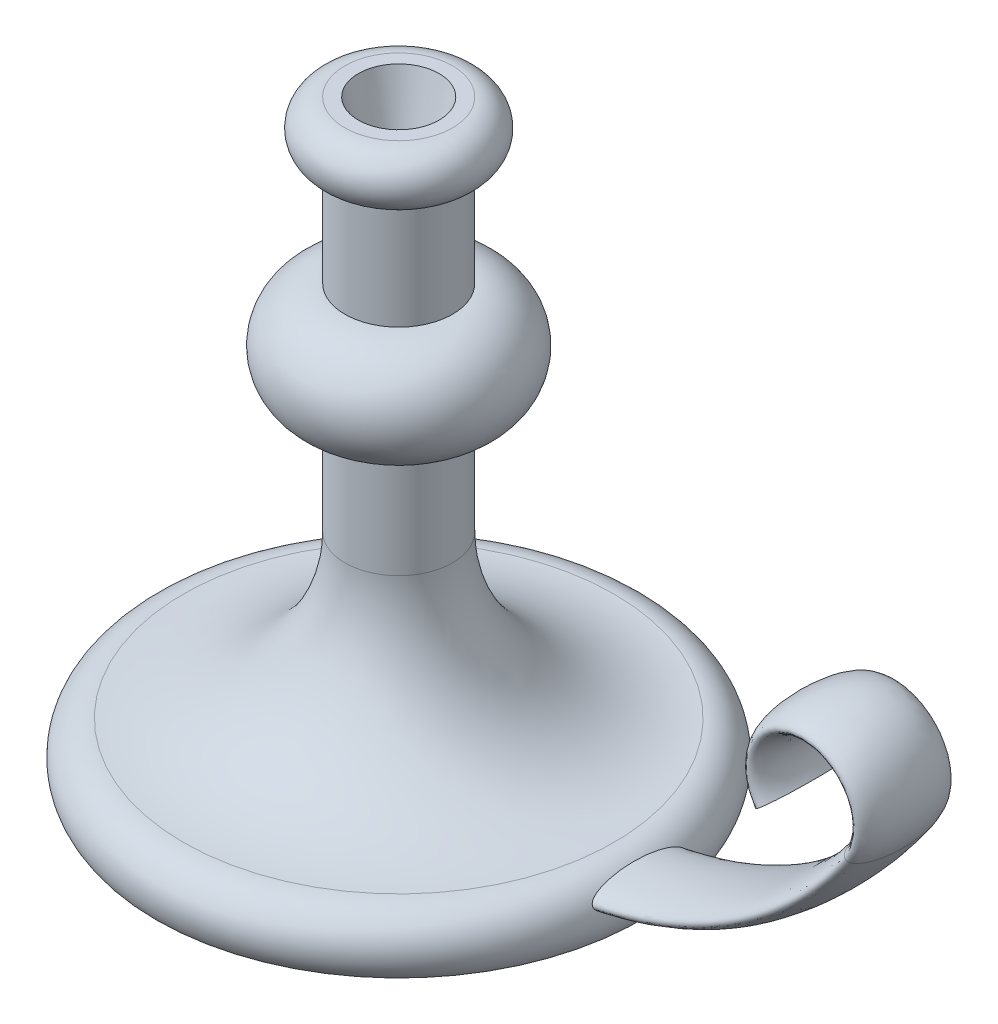
ISO-10303-21;
HEADER;
FILE_DESCRIPTION(('STEP AP214'),'2;1');
FILE_NAME('part.step','',(''),(''),'','','');
FILE_SCHEMA(('AUTOMOTIVE_DESIGN { 1 0 10303 214 1 1 1 1 }'));
ENDSEC;
DATA;
#1=APPLICATION_CONTEXT('core data for automotive mechanical design processes');
#2=APPLICATION_PROTOCOL_DEFINITION('international standard','automotive_design',2000,#1);
#3=PRODUCT_CONTEXT('',#1,'mechanical');
#4=PRODUCT('Part','Part','',(#3));
#5=PRODUCT_RELATED_PRODUCT_CATEGORY('part','',(#4));
#6=PRODUCT_DEFINITION_FORMATION('','',#4);
#7=PRODUCT_DEFINITION_CONTEXT('part definition',#1,'design');
#8=PRODUCT_DEFINITION('design','',#6,#7);
#9=PRODUCT_DEFINITION_SHAPE('','',#8);
#10=(LENGTH_UNIT() NAMED_UNIT(*) SI_UNIT(.MILLI.,.METRE.));
#11=(NAMED_UNIT(*) PLANE_ANGLE_UNIT() SI_UNIT($,.RADIAN.));
#12=(NAMED_UNIT(*) SI_UNIT($,.STERADIAN.) SOLID_ANGLE_UNIT());
#13=UNCERTAINTY_MEASURE_WITH_UNIT(LENGTH_MEASURE(1.E-05),#10,'distance_accuracy_value','');
#14=(GEOMETRIC_REPRESENTATION_CONTEXT(3) GLOBAL_UNCERTAINTY_ASSIGNED_CONTEXT((#13)) GLOBAL_UNIT_ASSIGNED_CONTEXT((#10,
#11,#12)) REPRESENTATION_CONTEXT('',''));
#15=CARTESIAN_POINT('',(0.,0.,0.));
#16=DIRECTION('',(0.,0.,1.));
#17=DIRECTION('',(1.,0.,0.));
#18=AXIS2_PLACEMENT_3D('',#15,#16,#17);
#19=CARTESIAN_POINT('',(0.,0.,0.));
#20=DIRECTION('',(0.,-1.,0.));
#21=DIRECTION('',(0.,0.,-1.));
#22=AXIS2_PLACEMENT_3D('',#19,#20,#21);
#23=PLANE('',#22);
#24=CARTESIAN_POINT('',(0.,0.,0.));
#25=DIRECTION('',(0.,-1.,0.));
#26=DIRECTION('',(0.,0.,-1.));
#27=AXIS2_PLACEMENT_3D('',#24,#25,#26);
#28=CIRCLE('',#27,90.);
#29=CARTESIAN_POINT('',(0.,0.,-90.));
#30=VERTEX_POINT('',#29);
#31=EDGE_CURVE('E81',#30,#30,#28,.T.);
#32=ORIENTED_EDGE('',*,*,#31,.T.);
#33=EDGE_LOOP('',(#32));
#34=FACE_BOUND('',#33,.T.);
#35=ADVANCED_FACE('F41',(#34),#23,.T.);
#36=CARTESIAN_POINT('',(0.,220.,0.));
#37=DIRECTION('',(0.,1.,0.));
#38=DIRECTION('',(0.,0.,1.));
#39=AXIS2_PLACEMENT_3D('',#36,#37,#38);
#40=PLANE('',#39);
#41=CARTESIAN_POINT('',(0.,220.,0.));
#42=DIRECTION('',(0.,1.,0.));
#43=DIRECTION('',(0.,0.,1.));
#44=AXIS2_PLACEMENT_3D('',#41,#42,#43);
#45=CIRCLE('',#44,15.);
#46=CARTESIAN_POINT('',(0.,220.,15.));
#47=VERTEX_POINT('',#46);
#48=EDGE_CURVE('E97',#47,#47,#45,.T.);
#49=ORIENTED_EDGE('',*,*,#48,.F.);
#50=EDGE_LOOP('',(#49));
#51=FACE_BOUND('',#50,.T.);
#52=CARTESIAN_POINT('',(0.,220.,0.));
#53=DIRECTION('',(0.,-1.,0.));
#54=DIRECTION('',(0.,0.,-1.));
#55=AXIS2_PLACEMENT_3D('',#52,#53,#54);
#56=CIRCLE('',#55,20.);
#57=CARTESIAN_POINT('',(0.,220.,-20.));
#58=VERTEX_POINT('',#57);
#59=EDGE_CURVE('E53',#58,#58,#56,.T.);
#60=ORIENTED_EDGE('',*,*,#59,.F.);
#61=EDGE_LOOP('',(#60));
#62=FACE_BOUND('',#61,.T.);
#63=ADVANCED_FACE('F104',(#51,#62),#40,.T.);
#64=CARTESIAN_POINT('',(0.,210.,0.));
#65=DIRECTION('',(0.,-1.,0.));
#66=DIRECTION('',(0.,0.,-1.));
#67=AXIS2_PLACEMENT_3D('',#64,#65,#66);
#68=TOROIDAL_SURFACE('',#67,20.,10.);
#69=ORIENTED_EDGE('',*,*,#59,.T.);
#70=EDGE_LOOP('',(#69));
#71=FACE_BOUND('',#70,.T.);
#72=CARTESIAN_POINT('',(0.,200.,0.));
#73=DIRECTION('',(0.,-1.,0.));
#74=DIRECTION('',(0.,0.,-1.));
#75=AXIS2_PLACEMENT_3D('',#72,#73,#74);
#76=CIRCLE('',#75,20.);
#77=CARTESIAN_POINT('',(0.,200.,-20.));
#78=VERTEX_POINT('',#77);
#79=EDGE_CURVE('E58',#78,#78,#76,.T.);
#80=ORIENTED_EDGE('',*,*,#79,.F.);
#81=EDGE_LOOP('',(#80));
#82=FACE_BOUND('',#81,.T.);
#83=ADVANCED_FACE('F107',(#71,#82),#68,.T.);
#84=CARTESIAN_POINT('',(0.,0.,0.));
#85=DIRECTION('',(0.,-1.,0.));
#86=DIRECTION('',(0.,0.,-1.));
#87=AXIS2_PLACEMENT_3D('',#84,#85,#86);
#88=CYLINDRICAL_SURFACE('',#87,20.);
#89=ORIENTED_EDGE('',*,*,#79,.T.);
#90=EDGE_LOOP('',(#89));
#91=FACE_BOUND('',#90,.T.);
#92=CARTESIAN_POINT('',(0.,160.,0.));
#93=DIRECTION('',(0.,-1.,0.));
#94=DIRECTION('',(0.,0.,-1.));
#95=AXIS2_PLACEMENT_3D('',#92,#93,#94);
#96=CIRCLE('',#95,20.);
#97=CARTESIAN_POINT('',(0.,160.,-20.));
#98=VERTEX_POINT('',#97);
#99=EDGE_CURVE('E63',#98,#98,#96,.T.);
#100=ORIENTED_EDGE('',*,*,#99,.F.);
#101=EDGE_LOOP('',(#100));
#102=FACE_BOUND('',#101,.T.);
#103=ADVANCED_FACE('F112',(#91,#102),#88,.T.);
#104=CARTESIAN_POINT('',(0.,140.,0.));
#105=DIRECTION('',(0.,-1.,0.));
#106=DIRECTION('',(0.,0.,-1.));
#107=AXIS2_PLACEMENT_3D('',#104,#105,#106);
#108=DEGENERATE_TOROIDAL_SURFACE('',#107,20.,20.,.T.);
#109=ORIENTED_EDGE('',*,*,#99,.T.);
#110=EDGE_LOOP('',(#109));
#111=FACE_BOUND('',#110,.T.);
#112=CARTESIAN_POINT('',(0.,120.,0.));
#113=DIRECTION('',(0.,-1.,0.));
#114=DIRECTION('',(0.,0.,-1.));
#115=AXIS2_PLACEMENT_3D('',#112,#113,#114);
#116=CIRCLE('',#115,20.);
#117=CARTESIAN_POINT('',(0.,120.,-20.));
#118=VERTEX_POINT('',#117);
#119=EDGE_CURVE('E69',#118,#118,#116,.T.);
#120=ORIENTED_EDGE('',*,*,#119,.F.);
#121=EDGE_LOOP('',(#120));
#122=FACE_BOUND('',#121,.T.);
#123=ADVANCED_FACE('F118',(#111,#122),#108,.T.);
#124=CARTESIAN_POINT('',(0.,0.,0.));
#125=DIRECTION('',(0.,-1.,0.));
#126=DIRECTION('',(0.,0.,-1.));
#127=AXIS2_PLACEMENT_3D('',#124,#125,#126);
#128=CYLINDRICAL_SURFACE('',#127,20.);
#129=ORIENTED_EDGE('',*,*,#119,.T.);
#130=EDGE_LOOP('',(#129));
#131=FACE_BOUND('',#130,.T.);
#132=CARTESIAN_POINT('',(0.,80.,0.));
#133=DIRECTION('',(0.,-1.,0.));
#134=DIRECTION('',(0.,0.,-1.));
#135=AXIS2_PLACEMENT_3D('',#132,#133,#134);
#136=CIRCLE('',#135,20.);
#137=CARTESIAN_POINT('',(0.,80.,-20.));
#138=VERTEX_POINT('',#137);
#139=EDGE_CURVE('E73',#138,#138,#136,.T.);
#140=ORIENTED_EDGE('',*,*,#139,.F.);
#141=EDGE_LOOP('',(#140));
#142=FACE_BOUND('',#141,.T.);
#143=ADVANCED_FACE('F122',(#131,#142),#128,.T.);
#144=CARTESIAN_POINT('',(0.,79.9999999999999,0.));
#145=DIRECTION('',(0.,-1.,0.));
#146=DIRECTION('',(0.,0.,-1.));
#147=AXIS2_PLACEMENT_3D('',#144,#145,#146);
#148=TOROIDAL_SURFACE('',#147,80.,60.);
#149=ORIENTED_EDGE('',*,*,#139,.T.);
#150=EDGE_LOOP('',(#149));
#151=FACE_BOUND('',#150,.T.);
#152=CARTESIAN_POINT('',(0.,19.9999999999999,0.));
#153=DIRECTION('',(0.,-1.,0.));
#154=DIRECTION('',(0.,0.,-1.));
#155=AXIS2_PLACEMENT_3D('',#152,#153,#154);
#156=CIRCLE('',#155,79.9999999999999);
#157=CARTESIAN_POINT('',(0.,19.9999999999999,-79.9999999999999));
#158=VERTEX_POINT('',#157);
#159=EDGE_CURVE('E77',#158,#158,#156,.T.);
#160=ORIENTED_EDGE('',*,*,#159,.F.);
#161=EDGE_LOOP('',(#160));
#162=FACE_BOUND('',#161,.T.);
#163=ADVANCED_FACE('F126',(#151,#162),#148,.F.);
#164=CARTESIAN_POINT('',(0.,7.49999999999991,0.));
#165=DIRECTION('',(0.,-1.,0.));
#166=DIRECTION('',(0.,0.,-1.));
#167=AXIS2_PLACEMENT_3D('',#164,#165,#166);
#168=TOROIDAL_SURFACE('',#167,79.9999999999999,12.5);
#169=CARTESIAN_POINT('',(89.559742204334,12.9414346567556,-17.5));
#170=CARTESIAN_POINT('',(89.539061840356,12.9834100865229,-17.4999996776707));
#171=CARTESIAN_POINT('',(89.5184817634658,13.0254349004938,-17.4978446678338));
#172=CARTESIAN_POINT('',(89.4776811982742,13.1092324497794,-17.4892861575811));
#173=CARTESIAN_POINT('',(89.4574608430709,13.1510050881611,-17.4828811168849));
#174=CARTESIAN_POINT('',(89.3975402811208,13.2754779151414,-17.4575154450276));
#175=CARTESIAN_POINT('',(89.3585808220612,13.357332519418,-17.4324042670614));
#176=CARTESIAN_POINT('',(89.2734407804367,13.537917999339,-17.3597430943198));
#177=CARTESIAN_POINT('',(89.2281116968573,13.6353152430682,-17.3079906529225));
#178=CARTESIAN_POINT('',(89.1421567137608,13.8217570109409,-17.1881654215547));
#179=CARTESIAN_POINT('',(89.1015409681599,13.9107834263932,-17.1200583326704));
#180=CARTESIAN_POINT('',(89.0298799325303,14.0690063055582,-16.9825317839868));
#181=CARTESIAN_POINT('',(88.998285603108,14.1392491335227,-16.9145677994464));
#182=CARTESIAN_POINT('',(88.9378435588021,14.2742914925202,-16.7722502997375));
#183=CARTESIAN_POINT('',(88.908998073478,14.3390866000317,-16.6978916893925));
#184=CARTESIAN_POINT('',(88.8536099995592,14.4639626152392,-16.544217780153));
#185=CARTESIAN_POINT('',(88.8270733532935,14.5240313225779,-16.4648905452803));
#186=CARTESIAN_POINT('',(88.7760376587062,14.6398576639347,-16.302586394246));
#187=CARTESIAN_POINT('',(88.7515379613227,14.6956166708124,-16.219610653644));
#188=CARTESIAN_POINT('',(88.7047328205489,14.8023169553037,-16.052427362784));
#189=CARTESIAN_POINT('',(88.6823939519364,14.8533308765833,-15.9682752160745));
#190=CARTESIAN_POINT('',(88.6391553657588,14.9521540950118,-15.7977416210759));
#191=CARTESIAN_POINT('',(88.618255889972,14.9999628537459,-15.711359801597));
#192=CARTESIAN_POINT('',(88.5573681790007,15.1392585624724,-15.4492483073625));
#193=CARTESIAN_POINT('',(88.5192579811326,15.2264609786255,-15.2707999543232));
#194=CARTESIAN_POINT('',(88.4468979005835,15.3916731276291,-14.9088289385943));
#195=CARTESIAN_POINT('',(88.4126513155025,15.4696750103546,-14.725302105289));
#196=CARTESIAN_POINT('',(88.3471391595038,15.6182965032923,-14.3538259785735));
#197=CARTESIAN_POINT('',(88.3158872528144,15.6888824046966,-14.1658608782526));
#198=CARTESIAN_POINT('',(88.2560127035515,15.8233792512431,-13.7874003918539));
#199=CARTESIAN_POINT('',(88.2273872233001,15.8872974109118,-13.5969079973402));
#200=CARTESIAN_POINT('',(88.1723348827447,16.0094159388249,-13.2138496737789));
#201=CARTESIAN_POINT('',(88.1459074726894,16.0676177374301,-13.0212842768929));
#202=CARTESIAN_POINT('',(88.08842483047,16.1932687928886,-12.5849658119246));
#203=CARTESIAN_POINT('',(88.0579162002182,16.2592725226906,-12.3407253521733));
#204=CARTESIAN_POINT('',(87.9994625659012,16.3844358500306,-11.850180346078));
#205=CARTESIAN_POINT('',(87.9715178234087,16.4435947494062,-11.6038755919221));
#206=CARTESIAN_POINT('',(87.9178897421856,16.5558889779776,-11.1095299870478));
#207=CARTESIAN_POINT('',(87.8922075114267,16.6090213595568,-10.8614883492399));
#208=CARTESIAN_POINT('',(87.8429155378601,16.7098546386226,-10.3640943607016));
#209=CARTESIAN_POINT('',(87.819305894281,16.7575552760879,-10.1147419478209));
#210=CARTESIAN_POINT('',(87.7514718906045,16.8930622945828,-9.36631396644889));
#211=CARTESIAN_POINT('',(87.7101114199138,16.97354616682,-8.86564202060303));
#212=CARTESIAN_POINT('',(87.6344118706352,17.1178657179368,-7.86153551840217));
#213=CARTESIAN_POINT('',(87.6000713341077,17.1817048544489,-7.35810155802552));
#214=CARTESIAN_POINT('',(87.5383679228552,17.2943697092708,-6.35225136111862));
#215=CARTESIAN_POINT('',(87.5109639050817,17.3432843238913,-5.84984753787545));
#216=CARTESIAN_POINT('',(87.462839163061,17.4279603163538,-4.84354228831));
#217=CARTESIAN_POINT('',(87.4421195253371,17.4637195559667,-4.3396406319408));
#218=CARTESIAN_POINT('',(87.4074386787953,17.5229738360405,-3.33084363886005));
#219=CARTESIAN_POINT('',(87.393478087488,17.5464677559495,-2.82594821558673));
#220=CARTESIAN_POINT('',(87.3724154174233,17.5817273168609,-1.81615213380796));
#221=CARTESIAN_POINT('',(87.3653059747337,17.5935055508652,-1.31125206554514));
#222=CARTESIAN_POINT('',(87.3579750479623,17.6056484066489,-0.301318309132852));
#223=CARTESIAN_POINT('',(87.3577528582348,17.6060141977103,0.203715360026144));
#224=CARTESIAN_POINT('',(87.3641963426437,17.5953454261039,1.21356726554174));
#225=CARTESIAN_POINT('',(87.3708612610894,17.5843121142068,1.71838551945512));
#226=CARTESIAN_POINT('',(87.3886163883336,17.554616306541,2.60695068649856));
#227=CARTESIAN_POINT('',(87.3982690399211,17.5384060734754,2.99081046478843));
#228=CARTESIAN_POINT('',(87.4214966880658,17.4990063104014,3.75807002785716));
#229=CARTESIAN_POINT('',(87.4350718235979,17.4758165331044,4.14146979585432));
#230=CARTESIAN_POINT('',(87.466110901612,17.4221255760208,4.90767543763214));
#231=CARTESIAN_POINT('',(87.4835755913647,17.3916229911934,5.29048118303764));
#232=CARTESIAN_POINT('',(87.5224765269598,17.3226675403927,6.05728766608042));
#233=CARTESIAN_POINT('',(87.5439339089182,17.2841722314846,6.44128353835447));
#234=CARTESIAN_POINT('',(87.5907685418076,17.1987228636429,7.20803081067563));
#235=CARTESIAN_POINT('',(87.6161451191904,17.1517702579396,7.59078241304237));
#236=CARTESIAN_POINT('',(87.6708875244927,17.0486132676472,8.35453102594122));
#237=CARTESIAN_POINT('',(87.7002509792862,16.9924143825779,8.73552894189143));
#238=CARTESIAN_POINT('',(87.755569338574,16.8844873931684,9.40362807317354));
#239=CARTESIAN_POINT('',(87.7806318626289,16.8349635590468,9.6911595586557));
#240=CARTESIAN_POINT('',(87.8333287645206,16.7293167465828,10.2648242071224));
#241=CARTESIAN_POINT('',(87.860963530467,16.6731927720484,10.5509571522123));
#242=CARTESIAN_POINT('',(87.9190678138247,16.5534902310351,11.1217112831613));
#243=CARTESIAN_POINT('',(87.9495404231882,16.4899035134826,11.4063304543326));
#244=CARTESIAN_POINT('',(88.0137266324374,16.3541216812726,11.9738772339477));
#245=CARTESIAN_POINT('',(88.0474477220506,16.2819065762201,12.2567992545899));
#246=CARTESIAN_POINT('',(88.1183718381952,16.1280994435203,12.8175821097589));
#247=CARTESIAN_POINT('',(88.1555499028382,16.046573796357,13.0954641920683));
#248=CARTESIAN_POINT('',(88.2343580118384,15.8719007074313,13.6468218234688));
#249=CARTESIAN_POINT('',(88.2759857295857,15.7787593350284,13.9202995902183));
#250=CARTESIAN_POINT('',(88.3426568223938,15.6283840406489,14.3254052817093));
#251=CARTESIAN_POINT('',(88.3655500017784,15.5765627213431,14.4594023169282));
#252=CARTESIAN_POINT('',(88.4129882653632,15.4688611687534,14.7254525655376));
#253=CARTESIAN_POINT('',(88.4375331689949,15.4129813790935,14.8575059894888));
#254=CARTESIAN_POINT('',(88.4884967907571,15.296726972035,15.1188747284345));
#255=CARTESIAN_POINT('',(88.5149109123157,15.2363633637365,15.2481958098581));
#256=CARTESIAN_POINT('',(88.570024175177,15.1103179001211,15.5037035642083));
#257=CARTESIAN_POINT('',(88.5987227483176,15.0446373670988,15.6298910063174));
#258=CARTESIAN_POINT('',(88.6570151826477,14.9113179601608,15.870419970706));
#259=CARTESIAN_POINT('',(88.6864417367859,14.8440563407289,15.9850095995261));
#260=CARTESIAN_POINT('',(88.7482816567767,14.7030103830826,16.2094581395953));
#261=CARTESIAN_POINT('',(88.780697475614,14.629220689998,16.3193130551169));
#262=CARTESIAN_POINT('',(88.8489097184971,14.4745639616531,16.5315146626624));
#263=CARTESIAN_POINT('',(88.8846785573507,14.3937550191611,16.6339121024917));
#264=CARTESIAN_POINT('',(88.9606113704151,14.2232561160766,16.8291907541923));
#265=CARTESIAN_POINT('',(89.0007675950251,14.1335818404864,16.9220882016583));
#266=CARTESIAN_POINT('',(89.0601235459871,14.0021924630804,17.0411637727685));
#267=CARTESIAN_POINT('',(89.0770574086404,13.9648250339927,17.073294917827));
#268=CARTESIAN_POINT('',(89.1117704043088,13.8885105828123,17.1351129203988));
#269=CARTESIAN_POINT('',(89.1295494801997,13.8495636674961,17.1647999427302));
#270=CARTESIAN_POINT('',(89.1842722230346,13.7301865324198,17.2496672583031));
#271=CARTESIAN_POINT('',(89.2225929343974,13.6472387371286,17.3006362954167));
#272=CARTESIAN_POINT('',(89.2830198855203,13.5177923286576,17.3659392171785));
#273=CARTESIAN_POINT('',(89.3038035106324,13.4734899832391,17.385944655127));
#274=CARTESIAN_POINT('',(89.346235727213,13.3835498526412,17.421521231844));
#275=CARTESIAN_POINT('',(89.3678838017235,13.3379128698458,17.4370949768748));
#276=CARTESIAN_POINT('',(89.4119048024239,13.2456714845448,17.4633118273199));
#277=CARTESIAN_POINT('',(89.4342765183815,13.1990687398023,17.4739627514632));
#278=CARTESIAN_POINT('',(89.4796070415906,13.1052444737537,17.4900003628641));
#279=CARTESIAN_POINT('',(89.5025657624808,13.0580230439623,17.495387819971));
#280=CARTESIAN_POINT('',(89.5464271716018,12.9684112208445,17.5004320668286));
#281=CARTESIAN_POINT('',(89.5672934245651,12.9260327119426,17.5006298436875));
#282=CARTESIAN_POINT('',(89.6091580078855,12.8415284156483,17.496667300483));
#283=CARTESIAN_POINT('',(89.6301563797467,12.7994027167221,17.4925055351934));
#284=CARTESIAN_POINT('',(89.6721156351429,12.7157496198108,17.479965082583));
#285=CARTESIAN_POINT('',(89.6930765014328,12.6742224548788,17.4715847960013));
#286=CARTESIAN_POINT('',(89.7348115258833,12.5920532516238,17.450862522026));
#287=CARTESIAN_POINT('',(89.755585576578,12.5514117057388,17.4385183877269));
#288=CARTESIAN_POINT('',(89.8013847331776,12.4623676182577,17.4070626989759));
#289=CARTESIAN_POINT('',(89.8263321178973,12.4142402057078,17.3870577635768));
#290=CARTESIAN_POINT('',(89.8756026524762,12.3198942829529,17.3423007335127));
#291=CARTESIAN_POINT('',(89.8999253272691,12.2736772101063,17.317545140678));
#292=CARTESIAN_POINT('',(89.9718636752114,12.1379719567038,17.2371059859824));
#293=CARTESIAN_POINT('',(90.0184026508767,12.0515209207989,17.1752845379973));
#294=CARTESIAN_POINT('',(90.1015176697337,11.8991704299986,17.0502729237444));
#295=CARTESIAN_POINT('',(90.1385373685484,11.8321383297489,16.9886971231213));
#296=CARTESIAN_POINT('',(90.2104869329279,11.7032426034951,16.8591573255862));
#297=CARTESIAN_POINT('',(90.2454151408798,11.6413830620089,16.7911883686366));
#298=CARTESIAN_POINT('',(90.3133841124365,11.5222099067342,16.6502911436157));
#299=CARTESIAN_POINT('',(90.3464212107124,11.4649050425,16.577353807455));
#300=CARTESIAN_POINT('',(90.4107258034174,11.3544143267812,16.4277349965839));
#301=CARTESIAN_POINT('',(90.4419937497578,11.3012274221162,16.3510544874357));
#302=CARTESIAN_POINT('',(90.5066142435686,11.1922810586095,16.1853189525368));
#303=CARTESIAN_POINT('',(90.5397652495638,11.1369814833085,16.095884783533));
#304=CARTESIAN_POINT('',(90.6043042941241,11.0303194621557,15.9140859303204));
#305=CARTESIAN_POINT('',(90.6356921559875,10.9789574107339,15.8217209538334));
#306=CARTESIAN_POINT('',(90.696838387797,10.879769884165,15.6347974994411));
#307=CARTESIAN_POINT('',(90.7265992701636,10.8319389137697,15.5402427441418));
#308=CARTESIAN_POINT('',(90.7846969346251,10.739329513768,15.3492353522603));
#309=CARTESIAN_POINT('',(90.8130337948204,10.6945509167066,15.2527828201661));
#310=CARTESIAN_POINT('',(90.8771212205239,10.5940589597548,15.027731983768));
#311=CARTESIAN_POINT('',(90.9124022819657,10.5393328792864,14.8985593440138));
#312=CARTESIAN_POINT('',(90.9809741103801,10.4339610325183,14.6380328432606));
#313=CARTESIAN_POINT('',(91.0142645951402,10.3833158444316,14.5066786763344));
#314=CARTESIAN_POINT('',(91.1115171918213,10.2366440116076,14.1096810918776));
#315=CARTESIAN_POINT('',(91.1727828792966,10.1460018602113,13.8413800425914));
#316=CARTESIAN_POINT('',(91.289286281246,9.976154557269,13.2997906638454));
#317=CARTESIAN_POINT('',(91.3445203789087,9.89695625887023,13.026499455453));
#318=CARTESIAN_POINT('',(91.449980571998,9.74769654866252,12.4748594155942));
#319=CARTESIAN_POINT('',(91.5001780442572,9.67768673078006,12.1964912536691));
#320=CARTESIAN_POINT('',(91.5957501918068,9.54592534416375,11.6372393425737));
#321=CARTESIAN_POINT('',(91.6411285723794,9.48416742117616,11.3563577087898));
#322=CARTESIAN_POINT('',(91.7275132616964,9.36779787162535,10.7925089006667));
#323=CARTESIAN_POINT('',(91.7685202729421,9.31318509647911,10.5095420692673));
#324=CARTESIAN_POINT('',(91.8503345045437,9.20520508711794,9.91387150213504));
#325=CARTESIAN_POINT('',(91.8907217744488,9.152493900958,9.60099168323481));
#326=CARTESIAN_POINT('',(91.9669218199109,9.05389158705521,8.97359688181812));
#327=CARTESIAN_POINT('',(92.002734366163,9.00800080116127,8.65908181815785));
#328=CARTESIAN_POINT('',(92.07003298894,8.92240020575297,8.02865568808615));
#329=CARTESIAN_POINT('',(92.1015177516249,8.88269227276186,7.71274422766328));
#330=CARTESIAN_POINT('',(92.1603325838503,8.80898713679297,7.07986626810441));
#331=CARTESIAN_POINT('',(92.1876625005419,8.77499014390492,6.76289973059227));
#332=CARTESIAN_POINT('',(92.263503001365,8.68114273902091,5.81249868362058));
#333=CARTESIAN_POINT('',(92.3060517448553,8.62919999492185,5.17778747193678));
#334=CARTESIAN_POINT('',(92.3760091017524,8.54431318450685,3.9062793818665));
#335=CARTESIAN_POINT('',(92.4034169750228,8.51137004695184,3.26948240305109));
#336=CARTESIAN_POINT('',(92.4435085691827,8.46331702284117,1.99545741778258));
#337=CARTESIAN_POINT('',(92.4562084043364,8.44818761908846,1.35823064985229));
#338=CARTESIAN_POINT('',(92.4671302630245,8.43517103988554,0.0834423270795608));
#339=CARTESIAN_POINT('',(92.4653514271758,8.43728488791035,-0.55411924538934));
#340=CARTESIAN_POINT('',(92.4472853754492,8.45883344750927,-1.82886328297122));
#341=CARTESIAN_POINT('',(92.4309954438923,8.47827140120335,-2.46604565478238));
#342=CARTESIAN_POINT('',(92.3836590626408,8.53514174464802,-3.73902583867153));
#343=CARTESIAN_POINT('',(92.352614080813,8.5725723444523,-4.37482378215656));
#344=CARTESIAN_POINT('',(92.2921790866401,8.64621329195009,-5.3662554446113));
#345=CARTESIAN_POINT('',(92.2680118235606,8.67578736963495,-5.72271555902012));
#346=CARTESIAN_POINT('',(92.2147013952353,8.74146404735406,-6.43465819603434));
#347=CARTESIAN_POINT('',(92.1855583836331,8.77756644580552,-6.79014074848109));
#348=CARTESIAN_POINT('',(92.1221127048891,8.85679311513365,-7.49983836059601));
#349=CARTESIAN_POINT('',(92.0878103957547,8.89991689880838,-7.85405350646578));
#350=CARTESIAN_POINT('',(92.0137981226248,8.99384143269665,-8.56089767224022));
#351=CARTESIAN_POINT('',(91.9740883343955,9.04464193338996,-8.9135267433144));
#352=CARTESIAN_POINT('',(91.9015818240061,9.13842562293733,-9.51226790233205));
#353=CARTESIAN_POINT('',(91.8702370654069,9.17924629619452,-9.7588957593429));
#354=CARTESIAN_POINT('',(91.8045624920056,9.26550036635929,-10.2509419620311));
#355=CARTESIAN_POINT('',(91.7702327567068,9.31093364041786,-10.4963603397384));
#356=CARTESIAN_POINT('',(91.6984266463269,9.40685898724898,-10.9855805665744));
#357=CARTESIAN_POINT('',(91.6609523533814,9.45734771681983,-11.2293833718174));
#358=CARTESIAN_POINT('',(91.582603896789,9.56401317099042,-11.7151775621055));
#359=CARTESIAN_POINT('',(91.5417298772534,9.62018965451331,-11.9571690234582));
#360=CARTESIAN_POINT('',(91.4386423376744,9.763512109964,-12.538416201849));
#361=CARTESIAN_POINT('',(91.3745858903286,9.85386844470763,-12.8765786557777));
#362=CARTESIAN_POINT('',(91.2720163238265,10.0014015523808,-13.3793136041317));
#363=CARTESIAN_POINT('',(91.236709096999,10.0526332971695,-13.5462966135012));
#364=CARTESIAN_POINT('',(91.1637294936455,10.159626184162,-13.878285337956));
#365=CARTESIAN_POINT('',(91.1260572231719,10.2153871233021,-14.0432911413079));
#366=CARTESIAN_POINT('',(91.0448513753995,10.336938272787,-14.3844416693133));
#367=CARTESIAN_POINT('',(91.0010908407913,10.40317678906,-14.5603739146119));
#368=CARTESIAN_POINT('',(90.9100440331644,10.54285093242,-14.9085311659835));
#369=CARTESIAN_POINT('',(90.8627565865344,10.6162889577865,-15.0807549132318));
#370=CARTESIAN_POINT('',(90.7642492199852,10.7715651970484,-15.4195496037307));
#371=CARTESIAN_POINT('',(90.7130423069864,10.853375906557,-15.5861368065588));
#372=CARTESIAN_POINT('',(90.6058220172111,11.0275348916432,-15.9120386126952));
#373=CARTESIAN_POINT('',(90.5498128203451,11.1198740259083,-16.0713593593327));
#374=CARTESIAN_POINT('',(90.4444082893049,11.2969255920344,-16.3465910082043));
#375=CARTESIAN_POINT('',(90.3961277047702,11.3791055101427,-16.4645448336192));
#376=CARTESIAN_POINT('',(90.2950977924845,11.5538633486869,-16.6911566146554));
#377=CARTESIAN_POINT('',(90.2423390562529,11.6464633011956,-16.7997939840169));
#378=CARTESIAN_POINT('',(90.1590440243454,11.7953014200275,-16.9524870890688));
#379=CARTESIAN_POINT('',(90.1303607600845,11.84698592154,-17.0019977189783));
#380=CARTESIAN_POINT('',(90.0716181087373,11.9538274561512,-17.0963102611101));
#381=CARTESIAN_POINT('',(90.0415584049392,12.0089852895526,-17.1411110817341));
#382=CARTESIAN_POINT('',(89.9801756575594,12.1227246632092,-17.2246441347399));
#383=CARTESIAN_POINT('',(89.9488577537649,12.1812926416251,-17.2633984155374));
#384=CARTESIAN_POINT('',(89.8849549671326,12.3020144005064,-17.3335784406432));
#385=CARTESIAN_POINT('',(89.8523712452271,12.3641649194657,-17.3650107233705));
#386=CARTESIAN_POINT('',(89.7981176909032,12.4687258013538,-17.4092508881816));
#387=CARTESIAN_POINT('',(89.7767436177654,12.5101841078547,-17.4246893204628));
#388=CARTESIAN_POINT('',(89.7336969050673,12.5942336377179,-17.4515182330193));
#389=CARTESIAN_POINT('',(89.712024381391,12.6368244270181,-17.4629102408533));
#390=CARTESIAN_POINT('',(89.6685521390581,12.7228207531293,-17.4812886417918));
#391=CARTESIAN_POINT('',(89.6467526103344,12.7662252198271,-17.488280453409));
#392=CARTESIAN_POINT('',(89.6031794397245,12.8535466229689,-17.4976362320133));
#393=CARTESIAN_POINT('',(89.5814057970821,12.8974635440192,-17.5000003376542));
#394=CARTESIAN_POINT('',(89.559742204334,12.9414346567556,-17.5));
#395=B_SPLINE_CURVE_WITH_KNOTS('',3,(#169,#170,#171,#172,#173,#174,#175,#176,#177,#178,#179,
#180,#181,#182,#183,#184,#185,#186,#187,#188,#189,#190,#191,#192,#193,#194,#195,#196,#197,#198,
#199,#200,#201,#202,#203,#204,#205,#206,#207,#208,#209,#210,#211,#212,#213,#214,#215,#216,#217,
#218,#219,#220,#221,#222,#223,#224,#225,#226,#227,#228,#229,#230,#231,#232,#233,#234,#235,#236,
#237,#238,#239,#240,#241,#242,#243,#244,#245,#246,#247,#248,#249,#250,#251,#252,#253,#254,#255,
#256,#257,#258,#259,#260,#261,#262,#263,#264,#265,#266,#267,#268,#269,#270,#271,#272,#273,#274,
#275,#276,#277,#278,#279,#280,#281,#282,#283,#284,#285,#286,#287,#288,#289,#290,#291,#292,#293,
#294,#295,#296,#297,#298,#299,#300,#301,#302,#303,#304,#305,#306,#307,#308,#309,#310,#311,#312,
#313,#314,#315,#316,#317,#318,#319,#320,#321,#322,#323,#324,#325,#326,#327,#328,#329,#330,#331,
#332,#333,#334,#335,#336,#337,#338,#339,#340,#341,#342,#343,#344,#345,#346,#347,#348,#349,#350,
#351,#352,#353,#354,#355,#356,#357,#358,#359,#360,#361,#362,#363,#364,#365,#366,#367,#368,#369,
#370,#371,#372,#373,#374,#375,#376,#377,#378,#379,#380,#381,#382,#383,#384,#385,#386,#387,#388,
#389,#390,#391,#392,#393,#394),.UNSPECIFIED.,.T.,.F.,(4,2,2,2,2,2,2,2,2,2,2,2,2,2,2,2,2,2,2,2,2,
2,2,2,2,2,2,2,2,2,2,2,2,2,2,2,2,2,2,2,2,2,2,2,2,2,2,2,2,2,2,2,2,2,2,2,2,2,2,2,2,2,2,2,2,2,2,2,2,
2,2,2,2,2,2,2,2,2,2,2,2,2,2,2,2,2,2,2,2,2,2,2,2,2,2,2,2,2,2,2,2,2,2,2,2,2,2,2,2,2,2,2,4),(0.,
0.140326879649318,0.280704643844314,0.561461806499952,0.917225717585815,1.27374235386086,
1.58146302398149,1.88943119593643,2.19816989275477,2.50680983170028,2.80944292372752,
3.11212672643259,3.71838915770196,4.32516518168251,4.93458970782549,5.54334784093543,
6.15195325906655,6.91631911029052,7.68076285707095,8.44557890144734,9.21043154271139,
10.7363530227228,12.2619572680852,13.7782885580524,15.2948661984784,16.8115823682403,
18.3266664767785,19.8415953542036,21.3563580231469,22.5092504482308,23.6621837256809,
24.8153386988898,25.9747813799631,27.1340250219355,28.2925816429425,29.1710242088839,
30.0495995331115,30.9291435591543,31.8107663507035,32.6864555684208,33.5616891298977,
33.9980703124478,34.4344038665404,34.8696994156048,35.3048870393031,35.7129485465614,
36.1213479397354,36.5266413619585,36.931230132163,37.0874810726011,37.2437214677038,
37.556282943945,37.7147148343192,37.8730533580127,38.0311395270883,38.1892025705742,
38.3307149014329,38.4722741597124,38.6138871242242,38.7555769191152,38.9286541005774,
39.1018592207182,39.448590135234,39.7429975955387,40.0376353818192,40.3328261359409,
40.6279411430424,40.9585479808937,41.2891878931732,41.6193018978019,41.9493977775693,
42.3832551508603,42.8171738887974,43.6859467918773,44.5552378220708,45.429218266337,
46.3025217875288,47.1756847521821,48.1351081860343,49.0945796914533,50.0543418354873,
51.0141392787946,52.9283366636025,54.8426276125099,56.7548192562828,58.667124399218,
60.5797874956882,62.4922603557716,63.5676819321866,64.643070307189,65.7183840946042,
66.7936629380637,67.5494303160615,68.3051775707202,69.0604283053787,69.8156470419362,
70.882676588736,71.4172057561806,71.9517109715335,72.5305894861733,73.1096614946439,
73.6868888443998,74.2636187787017,74.718095055338,75.1735510009093,75.4046853668805,
75.6358731855899,75.8661972266868,76.096314797092,76.2435550398537,76.3907396389804,
76.537742634799,76.6847412260987),.UNSPECIFIED.);
#396=CARTESIAN_POINT('',(89.559742204334,12.9414346567556,-17.5));
#397=VERTEX_POINT('',#396);
#398=EDGE_CURVE('E10',#397,#397,#395,.T.);
#399=ORIENTED_EDGE('',*,*,#398,.F.);
#400=EDGE_LOOP('',(#399));
#401=FACE_BOUND('',#400,.T.);
#402=ORIENTED_EDGE('',*,*,#159,.T.);
#403=EDGE_LOOP('',(#402));
#404=FACE_BOUND('',#403,.T.);
#405=ORIENTED_EDGE('',*,*,#31,.F.);
#406=EDGE_LOOP('',(#405));
#407=FACE_BOUND('',#406,.T.);
#408=ADVANCED_FACE('F129',(#401,#404,#407),#168,.T.);
#409=CARTESIAN_POINT('',(150.634185358261,75.,0.));
#410=DIRECTION('',(0.566666666666667,-0.823947139620552,0.));
#411=DIRECTION('',(0.,0.,-1.));
#412=AXIS2_PLACEMENT_3D('',#409,#410,#411);
#413=PLANE('',#412);
#414=CARTESIAN_POINT('',(150.634185358261,75.,0.));
#415=DIRECTION('',(0.566666666666667,-0.823947139620552,0.));
#416=DIRECTION('',(0.,0.,-1.));
#417=AXIS2_PLACEMENT_3D('',#414,#415,#416);
#418=ELLIPSE('',#417,17.5,5.);
#419=CARTESIAN_POINT('',(150.634185358261,75.,-17.5));
#420=VERTEX_POINT('',#419);
#421=EDGE_CURVE('E85',#420,#420,#418,.T.);
#422=ORIENTED_EDGE('',*,*,#421,.T.);
#423=EDGE_LOOP('',(#422));
#424=FACE_BOUND('',#423,.T.);
#425=ADVANCED_FACE('F134',(#424),#413,.T.);
#426=CARTESIAN_POINT('',(60.,10.,-17.5));
#427=CARTESIAN_POINT('',(110.410191303973,10.,-17.5));
#428=CARTESIAN_POINT('',(155.026295870831,33.4646670673665,-17.5));
#429=CARTESIAN_POINT('',(183.592070943083,75.,-17.5));
#430=CARTESIAN_POINT('',(60.,20.0000000000001,-17.5));
#431=CARTESIAN_POINT('',(107.049511883708,20.,-17.5));
#432=CARTESIAN_POINT('',(148.691209479442,41.9003559295421,-17.5));
#433=CARTESIAN_POINT('',(175.352599546877,80.6666666666667,-17.5));
#434=CARTESIAN_POINT('',(60.,20.0000000000001,17.5));
#435=CARTESIAN_POINT('',(107.049511883708,20.,17.5));
#436=CARTESIAN_POINT('',(148.691209479442,41.9003559295421,17.5));
#437=CARTESIAN_POINT('',(175.352599546877,80.6666666666667,17.5));
#438=CARTESIAN_POINT('',(60.,10.,17.5));
#439=CARTESIAN_POINT('',(110.410191303973,10.,17.5));
#440=CARTESIAN_POINT('',(155.026295870831,33.4646670673665,17.5));
#441=CARTESIAN_POINT('',(183.592070943083,75.,17.5));
#442=CARTESIAN_POINT('',(60.,0.,17.5));
#443=CARTESIAN_POINT('',(113.770870724238,0.,17.5));
#444=CARTESIAN_POINT('',(161.36138226222,25.0289782051909,17.5));
#445=CARTESIAN_POINT('',(191.831542339288,69.3333333333333,17.5));
#446=CARTESIAN_POINT('',(60.,0.,-17.5));
#447=CARTESIAN_POINT('',(113.770870724238,0.,-17.5));
#448=CARTESIAN_POINT('',(161.36138226222,25.0289782051909,-17.5));
#449=CARTESIAN_POINT('',(191.831542339288,69.3333333333333,-17.5));
#450=CARTESIAN_POINT('',(60.,10.,-17.5));
#451=CARTESIAN_POINT('',(110.410191303973,10.,-17.5));
#452=CARTESIAN_POINT('',(155.026295870831,33.4646670673665,-17.5));
#453=CARTESIAN_POINT('',(183.592070943083,75.,-17.5));
#454=(BOUNDED_SURFACE() B_SPLINE_SURFACE(3,3,((#426,#427,#428,#429),(#430,#431,#432,#433),(#434,
#435,#436,#437),(#438,#439,#440,#441),(#442,#443,#444,#445),(#446,#447,#448,#449),(#450,#451,
#452,#453)),.UNSPECIFIED.,.T.,.F.,.F.) B_SPLINE_SURFACE_WITH_KNOTS((4,3,4),(4,4),(0.,0.5,1.),
(0.,1.),.UNSPECIFIED.) GEOMETRIC_REPRESENTATION_ITEM() RATIONAL_B_SPLINE_SURFACE(((1.,
0.923374135437856,0.923374135437856,1.),(0.333333333333333,0.307791378479285,0.307791378479285,
0.333333333333333),(0.333333333333333,0.307791378479285,0.307791378479285,0.333333333333333),
(1.,0.923374135437856,0.923374135437856,1.),(0.333333333333333,0.307791378479285,
0.307791378479285,0.333333333333333),(0.333333333333333,0.307791378479285,0.307791378479285,
0.333333333333333),(1.,0.923374135437856,0.923374135437856,1.))) REPRESENTATION_ITEM('') SURFACE());
#455=CARTESIAN_POINT('',(183.592070943083,75.,0.));
#456=DIRECTION('',(0.566666666666667,0.823947139620552,0.));
#457=DIRECTION('',(0.,0.,-1.));
#458=AXIS2_PLACEMENT_3D('',#455,#456,#457);
#459=ELLIPSE('',#458,17.5,5.);
#460=CARTESIAN_POINT('',(183.592070943083,75.,-17.5));
#461=VERTEX_POINT('',#460);
#462=EDGE_CURVE('E89',#461,#461,#459,.T.);
#463=ORIENTED_EDGE('',*,*,#398,.T.);
#464=EDGE_LOOP('',(#463));
#465=FACE_BOUND('',#464,.T.);
#466=ORIENTED_EDGE('',*,*,#462,.F.);
#467=EDGE_LOOP('',(#466));
#468=FACE_BOUND('',#467,.T.);
#469=ADVANCED_FACE('F139',(#465,#468),#454,.T.);
#470=CARTESIAN_POINT('',(183.592070943083,75.,-17.5));
#471=CARTESIAN_POINT('',(193.981461744242,90.1064273523801,-17.5));
#472=CARTESIAN_POINT('',(185.447347211541,106.333333333333,-17.5));
#473=CARTESIAN_POINT('',(167.113128150672,106.333333333333,-17.5));
#474=CARTESIAN_POINT('',(148.778909089802,106.333333333333,-17.5));
#475=CARTESIAN_POINT('',(140.244794557101,90.1064273523801,-17.5));
#476=CARTESIAN_POINT('',(150.634185358261,75.,-17.5));
#477=CARTESIAN_POINT('',(175.352599546877,80.6666666666667,-17.5));
#478=CARTESIAN_POINT('',(180.547294947457,88.2198803428567,-17.5));
#479=CARTESIAN_POINT('',(176.280237681107,96.3333333333334,-17.5));
#480=CARTESIAN_POINT('',(167.113128150672,96.3333333333334,-17.5));
#481=CARTESIAN_POINT('',(157.946018620237,96.3333333333334,-17.5));
#482=CARTESIAN_POINT('',(153.678961353886,88.2198803428567,-17.5));
#483=CARTESIAN_POINT('',(158.873656754466,80.6666666666667,-17.5));
#484=CARTESIAN_POINT('',(175.352599546877,80.6666666666667,17.5));
#485=CARTESIAN_POINT('',(180.547294947457,88.2198803428567,17.5));
#486=CARTESIAN_POINT('',(176.280237681107,96.3333333333334,17.5));
#487=CARTESIAN_POINT('',(167.113128150672,96.3333333333334,17.5));
#488=CARTESIAN_POINT('',(157.946018620237,96.3333333333334,17.5));
#489=CARTESIAN_POINT('',(153.678961353886,88.2198803428567,17.5));
#490=CARTESIAN_POINT('',(158.873656754466,80.6666666666667,17.5));
#491=CARTESIAN_POINT('',(183.592070943083,75.,17.5));
#492=CARTESIAN_POINT('',(193.981461744242,90.1064273523801,17.5));
#493=CARTESIAN_POINT('',(185.447347211541,106.333333333333,17.5));
#494=CARTESIAN_POINT('',(167.113128150672,106.333333333333,17.5));
#495=CARTESIAN_POINT('',(148.778909089802,106.333333333333,17.5));
#496=CARTESIAN_POINT('',(140.244794557101,90.1064273523801,17.5));
#497=CARTESIAN_POINT('',(150.634185358261,75.,17.5));
#498=CARTESIAN_POINT('',(191.831542339288,69.3333333333333,17.5));
#499=CARTESIAN_POINT('',(207.415628541027,91.9929743619034,17.5));
#500=CARTESIAN_POINT('',(194.614456741976,116.333333333333,17.5));
#501=CARTESIAN_POINT('',(167.113128150672,116.333333333333,17.5));
#502=CARTESIAN_POINT('',(139.611799559367,116.333333333333,17.5));
#503=CARTESIAN_POINT('',(126.810627760316,91.9929743619035,17.5));
#504=CARTESIAN_POINT('',(142.394713962055,69.3333333333333,17.5));
#505=CARTESIAN_POINT('',(191.831542339288,69.3333333333333,-17.5));
#506=CARTESIAN_POINT('',(207.415628541027,91.9929743619034,-17.5));
#507=CARTESIAN_POINT('',(194.614456741976,116.333333333333,-17.5));
#508=CARTESIAN_POINT('',(167.113128150672,116.333333333333,-17.5));
#509=CARTESIAN_POINT('',(139.611799559367,116.333333333333,-17.5));
#510=CARTESIAN_POINT('',(126.810627760316,91.9929743619035,-17.5));
#511=CARTESIAN_POINT('',(142.394713962055,69.3333333333333,-17.5));
#512=CARTESIAN_POINT('',(183.592070943083,75.,-17.5));
#513=CARTESIAN_POINT('',(193.981461744242,90.1064273523801,-17.5));
#514=CARTESIAN_POINT('',(185.447347211541,106.333333333333,-17.5));
#515=CARTESIAN_POINT('',(167.113128150672,106.333333333333,-17.5));
#516=CARTESIAN_POINT('',(148.778909089802,106.333333333333,-17.5));
#517=CARTESIAN_POINT('',(140.244794557101,90.1064273523801,-17.5));
#518=CARTESIAN_POINT('',(150.634185358261,75.,-17.5));
#519=(BOUNDED_SURFACE() B_SPLINE_SURFACE(3,3,((#470,#471,#472,#473,#474,#475,#476),(#477,#478,
#479,#480,#481,#482,#483),(#484,#485,#486,#487,#488,#489,#490),(#491,#492,#493,#494,#495,#496,
#497),(#498,#499,#500,#501,#502,#503,#504),(#505,#506,#507,#508,#509,#510,#511),(#512,#513,#514,
#515,#516,#517,#518)),.UNSPECIFIED.,.T.,.F.,.F.) B_SPLINE_SURFACE_WITH_KNOTS((4,3,4),(4,3,4),
(0.,0.5,1.),(0.,0.5,1.),
.UNSPECIFIED.) GEOMETRIC_REPRESENTATION_ITEM() RATIONAL_B_SPLINE_SURFACE(((1.,0.643649778750421,
0.643649778750421,1.,0.643649778750421,0.643649778750421,1.),(0.333333333333333,
0.21454992625014,0.21454992625014,0.333333333333333,0.21454992625014,0.21454992625014,
0.333333333333333),(0.333333333333333,0.21454992625014,0.21454992625014,0.333333333333333,
0.21454992625014,0.21454992625014,0.333333333333333),(1.,0.643649778750421,0.643649778750421,1.,
0.643649778750421,0.643649778750421,1.),(0.333333333333333,0.21454992625014,0.21454992625014,
0.333333333333333,0.21454992625014,0.21454992625014,0.333333333333333),(0.333333333333333,
0.21454992625014,0.21454992625014,0.333333333333333,0.21454992625014,0.21454992625014,
0.333333333333333),(1.,0.643649778750421,0.643649778750421,1.,0.643649778750421,
0.643649778750421,1.))) REPRESENTATION_ITEM('') SURFACE());
#520=ORIENTED_EDGE('',*,*,#421,.F.);
#521=EDGE_LOOP('',(#520));
#522=FACE_BOUND('',#521,.T.);
#523=ORIENTED_EDGE('',*,*,#462,.T.);
#524=EDGE_LOOP('',(#523));
#525=FACE_BOUND('',#524,.T.);
#526=ADVANCED_FACE('F136',(#522,#525),#519,.T.);
#527=CARTESIAN_POINT('',(0.,220.,0.));
#528=DIRECTION('',(0.,1.,0.));
#529=DIRECTION('',(0.,0.,1.));
#530=AXIS2_PLACEMENT_3D('',#527,#528,#529);
#531=CONICAL_SURFACE('',#530,15.,0.26179938779915);
#532=CARTESIAN_POINT('',(0.,195.,0.));
#533=DIRECTION('',(0.,1.,0.));
#534=DIRECTION('',(0.,0.,1.));
#535=AXIS2_PLACEMENT_3D('',#532,#533,#534);
#536=CIRCLE('',#535,8.30127018922192);
#537=CARTESIAN_POINT('',(0.,195.,8.30127018922192));
#538=VERTEX_POINT('',#537);
#539=EDGE_CURVE('E93',#538,#538,#536,.T.);
#540=ORIENTED_EDGE('',*,*,#539,.F.);
#541=EDGE_LOOP('',(#540));
#542=FACE_BOUND('',#541,.T.);
#543=ORIENTED_EDGE('',*,*,#48,.T.);
#544=EDGE_LOOP('',(#543));
#545=FACE_BOUND('',#544,.T.);
#546=ADVANCED_FACE('F102',(#542,#545),#531,.F.);
#547=CARTESIAN_POINT('',(0.,195.,0.));
#548=DIRECTION('',(0.,1.,0.));
#549=DIRECTION('',(0.,0.,1.));
#550=AXIS2_PLACEMENT_3D('',#547,#548,#549);
#551=PLANE('',#550);
#552=ORIENTED_EDGE('',*,*,#539,.T.);
#553=EDGE_LOOP('',(#552));
#554=FACE_BOUND('',#553,.T.);
#555=ADVANCED_FACE('F162',(#554),#551,.T.);
#556=CLOSED_SHELL('',(#35,#63,#83,#103,#123,#143,#163,#408,#425,#469,#526,#546,#555));
#557=MANIFOLD_SOLID_BREP('B2',#556);
#558=ADVANCED_BREP_SHAPE_REPRESENTATION('',(#18,#557),#14);
#559=SHAPE_DEFINITION_REPRESENTATION(#9,#558);
ENDSEC;
END-ISO-10303-21;
